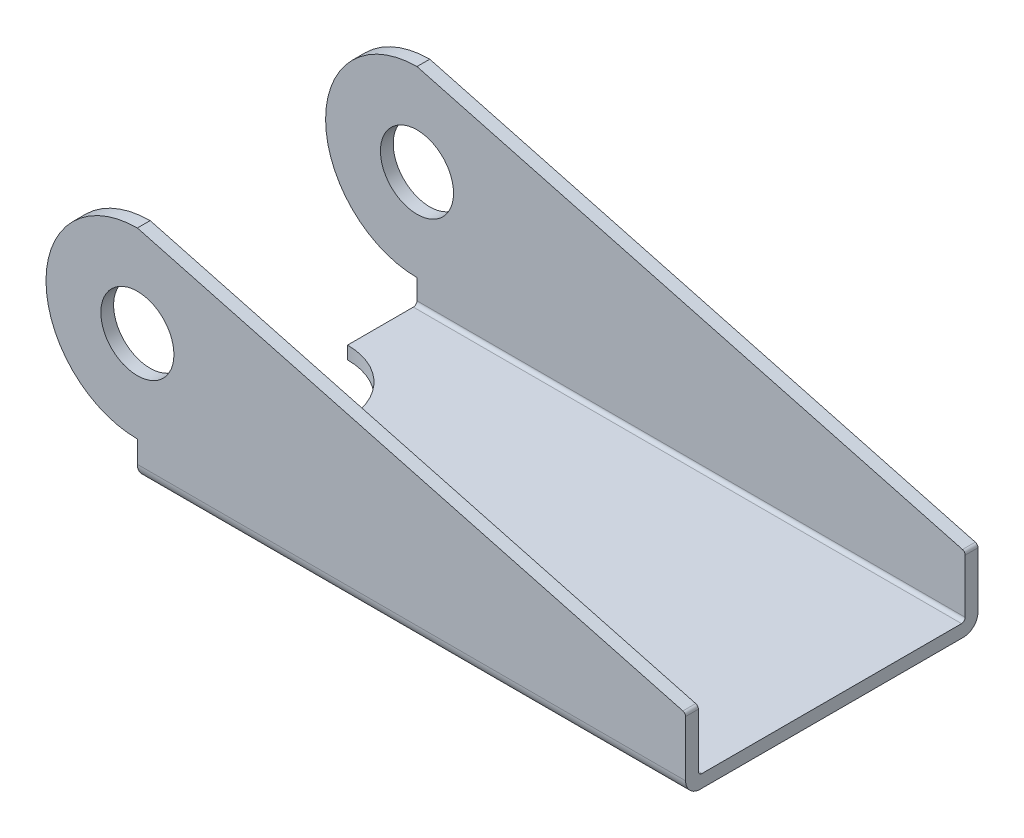
ISO-10303-21;
HEADER;
FILE_DESCRIPTION(('STEP AP214'),'2;1');
FILE_NAME('part.step','',(''),(''),'','','');
FILE_SCHEMA(('AUTOMOTIVE_DESIGN { 1 0 10303 214 1 1 1 1 }'));
ENDSEC;
DATA;
#1=APPLICATION_CONTEXT('core data for automotive mechanical design processes');
#2=APPLICATION_PROTOCOL_DEFINITION('international standard','automotive_design',2000,#1);
#3=PRODUCT_CONTEXT('',#1,'mechanical');
#4=PRODUCT('Part','Part','',(#3));
#5=PRODUCT_RELATED_PRODUCT_CATEGORY('part','',(#4));
#6=PRODUCT_DEFINITION_FORMATION('','',#4);
#7=PRODUCT_DEFINITION_CONTEXT('part definition',#1,'design');
#8=PRODUCT_DEFINITION('design','',#6,#7);
#9=PRODUCT_DEFINITION_SHAPE('','',#8);
#10=(LENGTH_UNIT() NAMED_UNIT(*) SI_UNIT(.MILLI.,.METRE.));
#11=(NAMED_UNIT(*) PLANE_ANGLE_UNIT() SI_UNIT($,.RADIAN.));
#12=(NAMED_UNIT(*) SI_UNIT($,.STERADIAN.) SOLID_ANGLE_UNIT());
#13=UNCERTAINTY_MEASURE_WITH_UNIT(LENGTH_MEASURE(1.E-05),#10,'distance_accuracy_value','');
#14=(GEOMETRIC_REPRESENTATION_CONTEXT(3) GLOBAL_UNCERTAINTY_ASSIGNED_CONTEXT((#13)) GLOBAL_UNIT_ASSIGNED_CONTEXT((#10,
#11,#12)) REPRESENTATION_CONTEXT('',''));
#15=CARTESIAN_POINT('',(0.,0.,0.));
#16=DIRECTION('',(0.,0.,1.));
#17=DIRECTION('',(1.,0.,0.));
#18=AXIS2_PLACEMENT_3D('',#15,#16,#17);
#19=CARTESIAN_POINT('',(-19.05,0.,-10.16));
#20=DIRECTION('',(-1.,0.,0.));
#21=DIRECTION('',(0.,-1.,0.));
#22=AXIS2_PLACEMENT_3D('',#19,#20,#21);
#23=PLANE('',#22);
#24=DIRECTION('',(0.,0.,1.));
#25=VECTOR('',#24,1.);
#26=CARTESIAN_POINT('',(-19.05,0.,-10.16));
#27=LINE('',#26,#25);
#28=CARTESIAN_POINT('',(-19.05,0.,4.445));
#29=VERTEX_POINT('',#28);
#30=CARTESIAN_POINT('',(-19.05,0.,9.144));
#31=VERTEX_POINT('',#30);
#32=EDGE_CURVE('E186',#29,#31,#27,.T.);
#33=ORIENTED_EDGE('',*,*,#32,.T.);
#34=CARTESIAN_POINT('',(-19.05,1.016,9.144));
#35=DIRECTION('',(-1.,0.,0.));
#36=DIRECTION('',(0.,-1.,0.));
#37=AXIS2_PLACEMENT_3D('',#34,#35,#36);
#38=CIRCLE('',#37,1.016);
#39=CARTESIAN_POINT('',(-19.05,1.016,10.16));
#40=VERTEX_POINT('',#39);
#41=EDGE_CURVE('E11',#31,#40,#38,.T.);
#42=ORIENTED_EDGE('',*,*,#41,.T.);
#43=DIRECTION('',(0.,-1.,0.));
#44=VECTOR('',#43,1.);
#45=CARTESIAN_POINT('',(-19.05,0.,10.16));
#46=LINE('',#45,#44);
#47=CARTESIAN_POINT('',(-19.05,2.54,10.16));
#48=VERTEX_POINT('',#47);
#49=EDGE_CURVE('E298',#48,#40,#46,.T.);
#50=ORIENTED_EDGE('',*,*,#49,.F.);
#51=DIRECTION('',(0.,0.,1.));
#52=VECTOR('',#51,1.);
#53=CARTESIAN_POINT('',(-19.05,2.54,-10.16));
#54=LINE('',#53,#52);
#55=CARTESIAN_POINT('',(-19.05,2.54,9.271));
#56=VERTEX_POINT('',#55);
#57=EDGE_CURVE('E328',#56,#48,#54,.T.);
#58=ORIENTED_EDGE('',*,*,#57,.F.);
#59=DIRECTION('',(0.,1.,0.));
#60=VECTOR('',#59,1.);
#61=CARTESIAN_POINT('',(-19.05,0.,9.271));
#62=LINE('',#61,#60);
#63=CARTESIAN_POINT('',(-19.05,1.143,9.271));
#64=VERTEX_POINT('',#63);
#65=EDGE_CURVE('E407',#64,#56,#62,.T.);
#66=ORIENTED_EDGE('',*,*,#65,.F.);
#67=CARTESIAN_POINT('',(-19.05,1.143,9.017));
#68=DIRECTION('',(-1.,0.,0.));
#69=DIRECTION('',(0.,-1.,0.));
#70=AXIS2_PLACEMENT_3D('',#67,#68,#69);
#71=CIRCLE('',#70,0.254);
#72=CARTESIAN_POINT('',(-19.05,0.889,9.017));
#73=VERTEX_POINT('',#72);
#74=EDGE_CURVE('E270',#64,#73,#71,.F.);
#75=ORIENTED_EDGE('',*,*,#74,.T.);
#76=DIRECTION('',(0.,0.,1.));
#77=VECTOR('',#76,1.);
#78=CARTESIAN_POINT('',(-19.05,0.889,-10.16));
#79=LINE('',#78,#77);
#80=CARTESIAN_POINT('',(-19.05,0.889,4.445));
#81=VERTEX_POINT('',#80);
#82=EDGE_CURVE('E188',#81,#73,#79,.T.);
#83=ORIENTED_EDGE('',*,*,#82,.F.);
#84=DIRECTION('',(0.,1.,0.));
#85=VECTOR('',#84,1.);
#86=CARTESIAN_POINT('',(-19.05,0.889,4.445));
#87=LINE('',#86,#85);
#88=EDGE_CURVE('E175',#29,#81,#87,.T.);
#89=ORIENTED_EDGE('',*,*,#88,.F.);
#90=EDGE_LOOP('',(#33,#42,#50,#58,#66,#75,#83,#89));
#91=FACE_BOUND('',#90,.T.);
#92=ADVANCED_FACE('F43',(#91),#23,.T.);
#93=CARTESIAN_POINT('',(-19.05,8.89,-10.16));
#94=DIRECTION('',(0.,0.,1.));
#95=DIRECTION('',(1.,0.,0.));
#96=AXIS2_PLACEMENT_3D('',#93,#94,#95);
#97=CYLINDRICAL_SURFACE('',#96,6.35);
#98=CARTESIAN_POINT('',(-19.05,8.89,-9.271));
#99=DIRECTION('',(0.,0.,-1.));
#100=DIRECTION('',(0.,1.,0.));
#101=AXIS2_PLACEMENT_3D('',#98,#99,#100);
#102=CIRCLE('',#101,6.35);
#103=CARTESIAN_POINT('',(-19.0500000000001,15.24,-9.271));
#104=VERTEX_POINT('',#103);
#105=CARTESIAN_POINT('',(-19.05,2.54,-9.271));
#106=VERTEX_POINT('',#105);
#107=EDGE_CURVE('E416',#104,#106,#102,.F.);
#108=ORIENTED_EDGE('',*,*,#107,.F.);
#109=DIRECTION('',(0.,0.,1.));
#110=VECTOR('',#109,1.);
#111=CARTESIAN_POINT('',(-19.05,15.24,-10.16));
#112=LINE('',#111,#110);
#113=CARTESIAN_POINT('',(-19.05,15.24,-10.16));
#114=VERTEX_POINT('',#113);
#115=EDGE_CURVE('E329',#114,#104,#112,.T.);
#116=ORIENTED_EDGE('',*,*,#115,.F.);
#117=CARTESIAN_POINT('',(-19.05,8.89,-10.16));
#118=DIRECTION('',(0.,0.,1.));
#119=DIRECTION('',(-1.,0.,0.));
#120=AXIS2_PLACEMENT_3D('',#117,#118,#119);
#121=CIRCLE('',#120,6.35);
#122=CARTESIAN_POINT('',(-19.05,2.54,-10.16));
#123=VERTEX_POINT('',#122);
#124=EDGE_CURVE('E198',#114,#123,#121,.T.);
#125=ORIENTED_EDGE('',*,*,#124,.T.);
#126=EDGE_CURVE('E214',#123,#106,#54,.T.);
#127=ORIENTED_EDGE('',*,*,#126,.T.);
#128=EDGE_LOOP('',(#108,#116,#125,#127));
#129=FACE_BOUND('',#128,.T.);
#130=ADVANCED_FACE('F354',(#129),#97,.T.);
#131=CARTESIAN_POINT('',(19.05,5.08,-10.16));
#132=DIRECTION('',(0.257662650560332,0.966234939601246,0.));
#133=DIRECTION('',(-0.966234939601246,0.257662650560332,0.));
#134=AXIS2_PLACEMENT_3D('',#131,#132,#133);
#135=PLANE('',#134);
#136=DIRECTION('',(-0.966234939601246,0.257662650560332,0.));
#137=VECTOR('',#136,1.);
#138=CARTESIAN_POINT('',(19.05,5.08,-9.271));
#139=LINE('',#138,#137);
#140=CARTESIAN_POINT('',(18.8614463132423,5.13028098313538,-9.271));
#141=VERTEX_POINT('',#140);
#142=EDGE_CURVE('E413',#141,#104,#139,.T.);
#143=ORIENTED_EDGE('',*,*,#142,.F.);
#144=DIRECTION('',(0.,0.,1.));
#145=VECTOR('',#144,1.);
#146=CARTESIAN_POINT('',(18.8614463132423,5.13028098313538,-10.16));
#147=LINE('',#146,#145);
#148=CARTESIAN_POINT('',(18.8614463132423,5.13028098313538,-10.16));
#149=VERTEX_POINT('',#148);
#150=EDGE_CURVE('E242',#141,#149,#147,.F.);
#151=ORIENTED_EDGE('',*,*,#150,.T.);
#152=DIRECTION('',(-0.966234939601246,0.257662650560332,0.));
#153=VECTOR('',#152,1.);
#154=CARTESIAN_POINT('',(19.05,5.08,-10.16));
#155=LINE('',#154,#153);
#156=EDGE_CURVE('E204',#149,#114,#155,.T.);
#157=ORIENTED_EDGE('',*,*,#156,.T.);
#158=ORIENTED_EDGE('',*,*,#115,.T.);
#159=EDGE_LOOP('',(#143,#151,#157,#158));
#160=FACE_BOUND('',#159,.T.);
#161=ADVANCED_FACE('F360',(#160),#135,.T.);
#162=DIRECTION('',(0.,-1.,0.));
#163=VECTOR('',#162,1.);
#164=CARTESIAN_POINT('',(-19.05,0.,-10.16));
#165=LINE('',#164,#163);
#166=CARTESIAN_POINT('',(-19.05,1.016,-10.16));
#167=VERTEX_POINT('',#166);
#168=EDGE_CURVE('E318',#123,#167,#165,.T.);
#169=ORIENTED_EDGE('',*,*,#168,.T.);
#170=CARTESIAN_POINT('',(-19.05,1.016,-9.144));
#171=DIRECTION('',(-1.,0.,0.));
#172=DIRECTION('',(0.,-1.,0.));
#173=AXIS2_PLACEMENT_3D('',#170,#171,#172);
#174=CIRCLE('',#173,1.016);
#175=CARTESIAN_POINT('',(-19.05,0.,-9.144));
#176=VERTEX_POINT('',#175);
#177=EDGE_CURVE('E287',#167,#176,#174,.T.);
#178=ORIENTED_EDGE('',*,*,#177,.T.);
#179=CARTESIAN_POINT('',(-19.05,0.,-4.445));
#180=VERTEX_POINT('',#179);
#181=EDGE_CURVE('E197',#176,#180,#27,.T.);
#182=ORIENTED_EDGE('',*,*,#181,.T.);
#183=DIRECTION('',(0.,1.,0.));
#184=VECTOR('',#183,1.);
#185=CARTESIAN_POINT('',(-19.05,0.889,-4.445));
#186=LINE('',#185,#184);
#187=CARTESIAN_POINT('',(-19.05,0.889,-4.445));
#188=VERTEX_POINT('',#187);
#189=EDGE_CURVE('E178',#188,#180,#186,.F.);
#190=ORIENTED_EDGE('',*,*,#189,.F.);
#191=CARTESIAN_POINT('',(-19.05,0.889,-9.017));
#192=VERTEX_POINT('',#191);
#193=EDGE_CURVE('E410',#192,#188,#79,.T.);
#194=ORIENTED_EDGE('',*,*,#193,.F.);
#195=CARTESIAN_POINT('',(-19.05,1.143,-9.017));
#196=DIRECTION('',(-1.,0.,0.));
#197=DIRECTION('',(0.,-1.,0.));
#198=AXIS2_PLACEMENT_3D('',#195,#196,#197);
#199=CIRCLE('',#198,0.254);
#200=CARTESIAN_POINT('',(-19.05,1.143,-9.271));
#201=VERTEX_POINT('',#200);
#202=EDGE_CURVE('E264',#192,#201,#199,.F.);
#203=ORIENTED_EDGE('',*,*,#202,.T.);
#204=DIRECTION('',(0.,-1.,0.));
#205=VECTOR('',#204,1.);
#206=CARTESIAN_POINT('',(-19.05,0.,-9.271));
#207=LINE('',#206,#205);
#208=EDGE_CURVE('E312',#106,#201,#207,.T.);
#209=ORIENTED_EDGE('',*,*,#208,.F.);
#210=ORIENTED_EDGE('',*,*,#126,.F.);
#211=EDGE_LOOP('',(#169,#178,#182,#190,#194,#203,#209,#210));
#212=FACE_BOUND('',#211,.T.);
#213=ADVANCED_FACE('F356',(#212),#23,.T.);
#214=CARTESIAN_POINT('',(-19.0500000000001,15.24,9.271));
#215=VERTEX_POINT('',#214);
#216=CARTESIAN_POINT('',(-19.05,15.24,10.16));
#217=VERTEX_POINT('',#216);
#218=EDGE_CURVE('E332',#215,#217,#112,.T.);
#219=ORIENTED_EDGE('',*,*,#218,.F.);
#220=CARTESIAN_POINT('',(-19.05,8.89,9.271));
#221=DIRECTION('',(0.,0.,1.));
#222=DIRECTION('',(0.,-1.,0.));
#223=AXIS2_PLACEMENT_3D('',#220,#221,#222);
#224=CIRCLE('',#223,6.35);
#225=EDGE_CURVE('E399',#56,#215,#224,.F.);
#226=ORIENTED_EDGE('',*,*,#225,.F.);
#227=ORIENTED_EDGE('',*,*,#57,.T.);
#228=CARTESIAN_POINT('',(-19.05,8.89,10.16));
#229=DIRECTION('',(0.,0.,1.));
#230=DIRECTION('',(-1.,0.,0.));
#231=AXIS2_PLACEMENT_3D('',#228,#229,#230);
#232=CIRCLE('',#231,6.35);
#233=EDGE_CURVE('E310',#217,#48,#232,.T.);
#234=ORIENTED_EDGE('',*,*,#233,.F.);
#235=EDGE_LOOP('',(#219,#226,#227,#234));
#236=FACE_BOUND('',#235,.T.);
#237=ADVANCED_FACE('F363',(#236),#97,.T.);
#238=DIRECTION('',(-0.966234939601246,0.257662650560332,0.));
#239=VECTOR('',#238,1.);
#240=CARTESIAN_POINT('',(19.05,5.08,10.16));
#241=LINE('',#240,#239);
#242=CARTESIAN_POINT('',(18.8614463132423,5.13028098313538,10.16));
#243=VERTEX_POINT('',#242);
#244=EDGE_CURVE('E306',#243,#217,#241,.T.);
#245=ORIENTED_EDGE('',*,*,#244,.F.);
#246=DIRECTION('',(0.,0.,1.));
#247=VECTOR('',#246,1.);
#248=CARTESIAN_POINT('',(18.8614463132423,5.13028098313538,-10.16));
#249=LINE('',#248,#247);
#250=CARTESIAN_POINT('',(18.8614463132423,5.13028098313538,9.271));
#251=VERTEX_POINT('',#250);
#252=EDGE_CURVE('E252',#243,#251,#249,.F.);
#253=ORIENTED_EDGE('',*,*,#252,.T.);
#254=DIRECTION('',(0.966234939601246,-0.257662650560332,0.));
#255=VECTOR('',#254,1.);
#256=CARTESIAN_POINT('',(19.05,5.08,9.271));
#257=LINE('',#256,#255);
#258=EDGE_CURVE('E393',#215,#251,#257,.T.);
#259=ORIENTED_EDGE('',*,*,#258,.F.);
#260=ORIENTED_EDGE('',*,*,#218,.T.);
#261=EDGE_LOOP('',(#245,#253,#259,#260));
#262=FACE_BOUND('',#261,.T.);
#263=ADVANCED_FACE('F372',(#262),#135,.T.);
#264=CARTESIAN_POINT('',(19.05,0.,-10.16));
#265=DIRECTION('',(1.,0.,0.));
#266=DIRECTION('',(0.,0.,-1.));
#267=AXIS2_PLACEMENT_3D('',#264,#265,#266);
#268=PLANE('',#267);
#269=DIRECTION('',(0.,0.,1.));
#270=VECTOR('',#269,1.);
#271=CARTESIAN_POINT('',(19.05,0.,-10.16));
#272=LINE('',#271,#270);
#273=CARTESIAN_POINT('',(19.05,0.,-9.144));
#274=VERTEX_POINT('',#273);
#275=CARTESIAN_POINT('',(19.05,0.,9.144));
#276=VERTEX_POINT('',#275);
#277=EDGE_CURVE('E202',#274,#276,#272,.T.);
#278=ORIENTED_EDGE('',*,*,#277,.F.);
#279=CARTESIAN_POINT('',(19.05,1.016,-9.144));
#280=DIRECTION('',(1.,0.,0.));
#281=DIRECTION('',(0.,0.,-1.));
#282=AXIS2_PLACEMENT_3D('',#279,#280,#281);
#283=CIRCLE('',#282,1.016);
#284=CARTESIAN_POINT('',(19.05,1.016,-10.16));
#285=VERTEX_POINT('',#284);
#286=EDGE_CURVE('E282',#274,#285,#283,.T.);
#287=ORIENTED_EDGE('',*,*,#286,.T.);
#288=DIRECTION('',(0.,1.,0.));
#289=VECTOR('',#288,1.);
#290=CARTESIAN_POINT('',(19.05,0.,-10.16));
#291=LINE('',#290,#289);
#292=CARTESIAN_POINT('',(19.05,4.88485730847666,-10.16));
#293=VERTEX_POINT('',#292);
#294=EDGE_CURVE('E321',#285,#293,#291,.T.);
#295=ORIENTED_EDGE('',*,*,#294,.T.);
#296=DIRECTION('',(0.,0.,1.));
#297=VECTOR('',#296,1.);
#298=CARTESIAN_POINT('',(19.05,4.88485730847666,-10.16));
#299=LINE('',#298,#297);
#300=CARTESIAN_POINT('',(19.05,4.88485730847666,-9.271));
#301=VERTEX_POINT('',#300);
#302=EDGE_CURVE('E238',#293,#301,#299,.T.);
#303=ORIENTED_EDGE('',*,*,#302,.T.);
#304=DIRECTION('',(0.,1.,0.));
#305=VECTOR('',#304,1.);
#306=CARTESIAN_POINT('',(19.05,0.889,-9.271));
#307=LINE('',#306,#305);
#308=CARTESIAN_POINT('',(19.05,1.143,-9.271));
#309=VERTEX_POINT('',#308);
#310=EDGE_CURVE('E387',#309,#301,#307,.T.);
#311=ORIENTED_EDGE('',*,*,#310,.F.);
#312=CARTESIAN_POINT('',(19.05,1.143,-9.017));
#313=DIRECTION('',(1.,0.,0.));
#314=DIRECTION('',(0.,0.,-1.));
#315=AXIS2_PLACEMENT_3D('',#312,#313,#314);
#316=CIRCLE('',#315,0.254);
#317=CARTESIAN_POINT('',(19.05,0.889,-9.017));
#318=VERTEX_POINT('',#317);
#319=EDGE_CURVE('E261',#309,#318,#316,.F.);
#320=ORIENTED_EDGE('',*,*,#319,.T.);
#321=DIRECTION('',(0.,0.,-1.));
#322=VECTOR('',#321,1.);
#323=CARTESIAN_POINT('',(19.05,0.889,9.271));
#324=LINE('',#323,#322);
#325=CARTESIAN_POINT('',(19.05,0.889,9.017));
#326=VERTEX_POINT('',#325);
#327=EDGE_CURVE('E394',#326,#318,#324,.T.);
#328=ORIENTED_EDGE('',*,*,#327,.F.);
#329=CARTESIAN_POINT('',(19.05,1.143,9.017));
#330=DIRECTION('',(1.,0.,0.));
#331=DIRECTION('',(0.,0.,-1.));
#332=AXIS2_PLACEMENT_3D('',#329,#330,#331);
#333=CIRCLE('',#332,0.254);
#334=CARTESIAN_POINT('',(19.05,1.143,9.271));
#335=VERTEX_POINT('',#334);
#336=EDGE_CURVE('E267',#326,#335,#333,.F.);
#337=ORIENTED_EDGE('',*,*,#336,.T.);
#338=DIRECTION('',(0.,-1.,0.));
#339=VECTOR('',#338,1.);
#340=CARTESIAN_POINT('',(19.05,0.,9.271));
#341=LINE('',#340,#339);
#342=CARTESIAN_POINT('',(19.05,4.88485730847666,9.271));
#343=VERTEX_POINT('',#342);
#344=EDGE_CURVE('E209',#343,#335,#341,.T.);
#345=ORIENTED_EDGE('',*,*,#344,.F.);
#346=DIRECTION('',(0.,0.,1.));
#347=VECTOR('',#346,1.);
#348=CARTESIAN_POINT('',(19.05,4.88485730847666,-10.16));
#349=LINE('',#348,#347);
#350=CARTESIAN_POINT('',(19.05,4.88485730847666,10.16));
#351=VERTEX_POINT('',#350);
#352=EDGE_CURVE('E234',#343,#351,#349,.T.);
#353=ORIENTED_EDGE('',*,*,#352,.T.);
#354=DIRECTION('',(0.,1.,0.));
#355=VECTOR('',#354,1.);
#356=CARTESIAN_POINT('',(19.05,0.,10.16));
#357=LINE('',#356,#355);
#358=CARTESIAN_POINT('',(19.05,1.016,10.16));
#359=VERTEX_POINT('',#358);
#360=EDGE_CURVE('E295',#359,#351,#357,.T.);
#361=ORIENTED_EDGE('',*,*,#360,.F.);
#362=CARTESIAN_POINT('',(19.05,1.016,9.144));
#363=DIRECTION('',(1.,0.,0.));
#364=DIRECTION('',(0.,0.,-1.));
#365=AXIS2_PLACEMENT_3D('',#362,#363,#364);
#366=CIRCLE('',#365,1.016);
#367=EDGE_CURVE('E279',#359,#276,#366,.T.);
#368=ORIENTED_EDGE('',*,*,#367,.T.);
#369=EDGE_LOOP('',(#278,#287,#295,#303,#311,#320,#328,#337,#345,#353,#361,#368));
#370=FACE_BOUND('',#369,.T.);
#371=ADVANCED_FACE('F302',(#370),#268,.T.);
#372=CARTESIAN_POINT('',(-19.05,0.,-10.16));
#373=DIRECTION('',(0.,-1.,0.));
#374=DIRECTION('',(1.,0.,0.));
#375=AXIS2_PLACEMENT_3D('',#372,#373,#374);
#376=PLANE('',#375);
#377=ORIENTED_EDGE('',*,*,#181,.F.);
#378=DIRECTION('',(1.,0.,0.));
#379=VECTOR('',#378,1.);
#380=CARTESIAN_POINT('',(-19.05,0.,-9.144));
#381=LINE('',#380,#379);
#382=EDGE_CURVE('E275',#176,#274,#381,.T.);
#383=ORIENTED_EDGE('',*,*,#382,.T.);
#384=ORIENTED_EDGE('',*,*,#277,.T.);
#385=DIRECTION('',(1.,0.,0.));
#386=VECTOR('',#385,1.);
#387=CARTESIAN_POINT('',(-19.05,0.,9.144));
#388=LINE('',#387,#386);
#389=EDGE_CURVE('E195',#276,#31,#388,.F.);
#390=ORIENTED_EDGE('',*,*,#389,.T.);
#391=ORIENTED_EDGE('',*,*,#32,.F.);
#392=CARTESIAN_POINT('',(-19.05,0.,0.));
#393=DIRECTION('',(0.,1.,0.));
#394=DIRECTION('',(0.,0.,1.));
#395=AXIS2_PLACEMENT_3D('',#392,#393,#394);
#396=CIRCLE('',#395,4.445);
#397=EDGE_CURVE('E171',#29,#180,#396,.T.);
#398=ORIENTED_EDGE('',*,*,#397,.T.);
#399=EDGE_LOOP('',(#377,#383,#384,#390,#391,#398));
#400=FACE_BOUND('',#399,.T.);
#401=ADVANCED_FACE('F192',(#400),#376,.T.);
#402=CARTESIAN_POINT('',(-19.05,8.89,-10.16));
#403=DIRECTION('',(0.,0.,-1.));
#404=DIRECTION('',(-1.,0.,0.));
#405=AXIS2_PLACEMENT_3D('',#402,#403,#404);
#406=PLANE('',#405);
#407=CARTESIAN_POINT('',(-19.05,8.89,-10.16));
#408=DIRECTION('',(0.,0.,1.));
#409=DIRECTION('',(1.,0.,0.));
#410=AXIS2_PLACEMENT_3D('',#407,#408,#409);
#411=CIRCLE('',#410,2.54);
#412=CARTESIAN_POINT('',(-16.51,8.89,-10.16));
#413=VERTEX_POINT('',#412);
#414=EDGE_CURVE('E220',#413,#413,#411,.T.);
#415=ORIENTED_EDGE('',*,*,#414,.T.);
#416=EDGE_LOOP('',(#415));
#417=FACE_BOUND('',#416,.T.);
#418=ORIENTED_EDGE('',*,*,#294,.F.);
#419=DIRECTION('',(1.,0.,0.));
#420=VECTOR('',#419,1.);
#421=CARTESIAN_POINT('',(-19.05,1.016,-10.16));
#422=LINE('',#421,#420);
#423=EDGE_CURVE('E65',#285,#167,#422,.F.);
#424=ORIENTED_EDGE('',*,*,#423,.T.);
#425=ORIENTED_EDGE('',*,*,#168,.F.);
#426=ORIENTED_EDGE('',*,*,#124,.F.);
#427=ORIENTED_EDGE('',*,*,#156,.F.);
#428=CARTESIAN_POINT('',(18.796,4.88485730847666,-10.16));
#429=DIRECTION('',(0.,0.,-1.));
#430=DIRECTION('',(-1.,0.,0.));
#431=AXIS2_PLACEMENT_3D('',#428,#429,#430);
#432=CIRCLE('',#431,0.254);
#433=EDGE_CURVE('E245',#149,#293,#432,.T.);
#434=ORIENTED_EDGE('',*,*,#433,.T.);
#435=EDGE_LOOP('',(#418,#424,#425,#426,#427,#434));
#436=FACE_BOUND('',#435,.T.);
#437=ADVANCED_FACE('F378',(#417,#436),#406,.T.);
#438=CARTESIAN_POINT('',(-19.05,8.89,10.16));
#439=DIRECTION('',(0.,0.,-1.));
#440=DIRECTION('',(-1.,0.,0.));
#441=AXIS2_PLACEMENT_3D('',#438,#439,#440);
#442=PLANE('',#441);
#443=CARTESIAN_POINT('',(-19.05,8.89,10.16));
#444=DIRECTION('',(0.,0.,1.));
#445=DIRECTION('',(1.,0.,0.));
#446=AXIS2_PLACEMENT_3D('',#443,#444,#445);
#447=CIRCLE('',#446,2.54);
#448=CARTESIAN_POINT('',(-16.51,8.89,10.16));
#449=VERTEX_POINT('',#448);
#450=EDGE_CURVE('E190',#449,#449,#447,.T.);
#451=ORIENTED_EDGE('',*,*,#450,.F.);
#452=EDGE_LOOP('',(#451));
#453=FACE_BOUND('',#452,.T.);
#454=ORIENTED_EDGE('',*,*,#49,.T.);
#455=DIRECTION('',(1.,0.,0.));
#456=VECTOR('',#455,1.);
#457=CARTESIAN_POINT('',(19.05,1.016,10.16));
#458=LINE('',#457,#456);
#459=EDGE_CURVE('E52',#40,#359,#458,.T.);
#460=ORIENTED_EDGE('',*,*,#459,.T.);
#461=ORIENTED_EDGE('',*,*,#360,.T.);
#462=CARTESIAN_POINT('',(18.796,4.88485730847666,10.16));
#463=DIRECTION('',(0.,0.,-1.));
#464=DIRECTION('',(-1.,0.,0.));
#465=AXIS2_PLACEMENT_3D('',#462,#463,#464);
#466=CIRCLE('',#465,0.254);
#467=EDGE_CURVE('E249',#351,#243,#466,.F.);
#468=ORIENTED_EDGE('',*,*,#467,.T.);
#469=ORIENTED_EDGE('',*,*,#244,.T.);
#470=ORIENTED_EDGE('',*,*,#233,.T.);
#471=EDGE_LOOP('',(#454,#460,#461,#468,#469,#470));
#472=FACE_BOUND('',#471,.T.);
#473=ADVANCED_FACE('F294',(#453,#472),#442,.F.);
#474=CARTESIAN_POINT('',(-25.4,0.889,-9.271));
#475=DIRECTION('',(0.,0.,-1.));
#476=DIRECTION('',(0.,1.,0.));
#477=AXIS2_PLACEMENT_3D('',#474,#475,#476);
#478=PLANE('',#477);
#479=CARTESIAN_POINT('',(-19.05,8.89,-9.271));
#480=DIRECTION('',(0.,0.,-1.));
#481=DIRECTION('',(0.,1.,0.));
#482=AXIS2_PLACEMENT_3D('',#479,#480,#481);
#483=CIRCLE('',#482,2.54);
#484=CARTESIAN_POINT('',(-19.05,11.43,-9.271));
#485=VERTEX_POINT('',#484);
#486=EDGE_CURVE('E219',#485,#485,#483,.T.);
#487=ORIENTED_EDGE('',*,*,#486,.T.);
#488=EDGE_LOOP('',(#487));
#489=FACE_BOUND('',#488,.T.);
#490=ORIENTED_EDGE('',*,*,#208,.T.);
#491=DIRECTION('',(1.,0.,0.));
#492=VECTOR('',#491,1.);
#493=CARTESIAN_POINT('',(19.05,1.143,-9.271));
#494=LINE('',#493,#492);
#495=EDGE_CURVE('E223',#201,#309,#494,.T.);
#496=ORIENTED_EDGE('',*,*,#495,.T.);
#497=ORIENTED_EDGE('',*,*,#310,.T.);
#498=CARTESIAN_POINT('',(18.796,4.88485730847666,-9.271));
#499=DIRECTION('',(0.,0.,-1.));
#500=DIRECTION('',(0.,1.,0.));
#501=AXIS2_PLACEMENT_3D('',#498,#499,#500);
#502=CIRCLE('',#501,0.254);
#503=EDGE_CURVE('E213',#301,#141,#502,.F.);
#504=ORIENTED_EDGE('',*,*,#503,.T.);
#505=ORIENTED_EDGE('',*,*,#142,.T.);
#506=ORIENTED_EDGE('',*,*,#107,.T.);
#507=EDGE_LOOP('',(#490,#496,#497,#504,#505,#506));
#508=FACE_BOUND('',#507,.T.);
#509=ADVANCED_FACE('F390',(#489,#508),#478,.F.);
#510=CARTESIAN_POINT('',(-25.4,0.889,9.271));
#511=DIRECTION('',(0.,-1.,0.));
#512=DIRECTION('',(0.,0.,-1.));
#513=AXIS2_PLACEMENT_3D('',#510,#511,#512);
#514=PLANE('',#513);
#515=ORIENTED_EDGE('',*,*,#327,.T.);
#516=DIRECTION('',(1.,0.,0.));
#517=VECTOR('',#516,1.);
#518=CARTESIAN_POINT('',(-19.05,0.889,-9.017));
#519=LINE('',#518,#517);
#520=EDGE_CURVE('E231',#318,#192,#519,.F.);
#521=ORIENTED_EDGE('',*,*,#520,.T.);
#522=ORIENTED_EDGE('',*,*,#193,.T.);
#523=CARTESIAN_POINT('',(-19.05,0.889,0.));
#524=DIRECTION('',(0.,1.,0.));
#525=DIRECTION('',(0.,0.,1.));
#526=AXIS2_PLACEMENT_3D('',#523,#524,#525);
#527=CIRCLE('',#526,4.445);
#528=EDGE_CURVE('E183',#81,#188,#527,.T.);
#529=ORIENTED_EDGE('',*,*,#528,.F.);
#530=ORIENTED_EDGE('',*,*,#82,.T.);
#531=DIRECTION('',(1.,0.,0.));
#532=VECTOR('',#531,1.);
#533=CARTESIAN_POINT('',(19.05,0.889,9.017));
#534=LINE('',#533,#532);
#535=EDGE_CURVE('E227',#73,#326,#534,.T.);
#536=ORIENTED_EDGE('',*,*,#535,.T.);
#537=EDGE_LOOP('',(#515,#521,#522,#529,#530,#536));
#538=FACE_BOUND('',#537,.T.);
#539=ADVANCED_FACE('F426',(#538),#514,.F.);
#540=CARTESIAN_POINT('',(-25.4,15.24,9.271));
#541=DIRECTION('',(0.,0.,1.));
#542=DIRECTION('',(0.,-1.,0.));
#543=AXIS2_PLACEMENT_3D('',#540,#541,#542);
#544=PLANE('',#543);
#545=CARTESIAN_POINT('',(-19.05,8.89,9.271));
#546=DIRECTION('',(0.,0.,1.));
#547=DIRECTION('',(0.,-1.,0.));
#548=AXIS2_PLACEMENT_3D('',#545,#546,#547);
#549=CIRCLE('',#548,2.54);
#550=CARTESIAN_POINT('',(-19.05,6.35,9.271));
#551=VERTEX_POINT('',#550);
#552=EDGE_CURVE('E215',#551,#551,#549,.T.);
#553=ORIENTED_EDGE('',*,*,#552,.T.);
#554=EDGE_LOOP('',(#553));
#555=FACE_BOUND('',#554,.T.);
#556=ORIENTED_EDGE('',*,*,#258,.T.);
#557=CARTESIAN_POINT('',(18.796,4.88485730847666,9.271));
#558=DIRECTION('',(0.,0.,1.));
#559=DIRECTION('',(0.,-1.,0.));
#560=AXIS2_PLACEMENT_3D('',#557,#558,#559);
#561=CIRCLE('',#560,0.254);
#562=EDGE_CURVE('E258',#251,#343,#561,.F.);
#563=ORIENTED_EDGE('',*,*,#562,.T.);
#564=ORIENTED_EDGE('',*,*,#344,.T.);
#565=DIRECTION('',(1.,0.,0.));
#566=VECTOR('',#565,1.);
#567=CARTESIAN_POINT('',(-19.05,1.143,9.271));
#568=LINE('',#567,#566);
#569=EDGE_CURVE('E255',#335,#64,#568,.F.);
#570=ORIENTED_EDGE('',*,*,#569,.T.);
#571=ORIENTED_EDGE('',*,*,#65,.T.);
#572=ORIENTED_EDGE('',*,*,#225,.T.);
#573=EDGE_LOOP('',(#556,#563,#564,#570,#571,#572));
#574=FACE_BOUND('',#573,.T.);
#575=ADVANCED_FACE('F433',(#555,#574),#544,.F.);
#576=CARTESIAN_POINT('',(-19.05,8.89,10.16));
#577=DIRECTION('',(0.,0.,1.));
#578=DIRECTION('',(1.,0.,0.));
#579=AXIS2_PLACEMENT_3D('',#576,#577,#578);
#580=CYLINDRICAL_SURFACE('',#579,2.54);
#581=ORIENTED_EDGE('',*,*,#450,.T.);
#582=EDGE_LOOP('',(#581));
#583=FACE_BOUND('',#582,.T.);
#584=ORIENTED_EDGE('',*,*,#552,.F.);
#585=EDGE_LOOP('',(#584));
#586=FACE_BOUND('',#585,.T.);
#587=ADVANCED_FACE('F461',(#583,#586),#580,.F.);
#588=ORIENTED_EDGE('',*,*,#414,.F.);
#589=EDGE_LOOP('',(#588));
#590=FACE_BOUND('',#589,.T.);
#591=ORIENTED_EDGE('',*,*,#486,.F.);
#592=EDGE_LOOP('',(#591));
#593=FACE_BOUND('',#592,.T.);
#594=ADVANCED_FACE('F468',(#590,#593),#580,.F.);
#595=CARTESIAN_POINT('',(-19.05,0.889,0.));
#596=DIRECTION('',(0.,1.,0.));
#597=DIRECTION('',(0.,0.,1.));
#598=AXIS2_PLACEMENT_3D('',#595,#596,#597);
#599=CYLINDRICAL_SURFACE('',#598,4.445);
#600=ORIENTED_EDGE('',*,*,#88,.T.);
#601=ORIENTED_EDGE('',*,*,#528,.T.);
#602=ORIENTED_EDGE('',*,*,#189,.T.);
#603=ORIENTED_EDGE('',*,*,#397,.F.);
#604=EDGE_LOOP('',(#600,#601,#602,#603));
#605=FACE_BOUND('',#604,.T.);
#606=ADVANCED_FACE('F173',(#605),#599,.F.);
#607=CARTESIAN_POINT('',(-25.4,1.143,-9.017));
#608=DIRECTION('',(-1.,0.,0.));
#609=DIRECTION('',(0.,0.,1.));
#610=AXIS2_PLACEMENT_3D('',#607,#608,#609);
#611=CYLINDRICAL_SURFACE('',#610,0.254);
#612=ORIENTED_EDGE('',*,*,#202,.F.);
#613=ORIENTED_EDGE('',*,*,#520,.F.);
#614=ORIENTED_EDGE('',*,*,#319,.F.);
#615=ORIENTED_EDGE('',*,*,#495,.F.);
#616=EDGE_LOOP('',(#612,#613,#614,#615));
#617=FACE_BOUND('',#616,.T.);
#618=ADVANCED_FACE('F422',(#617),#611,.F.);
#619=CARTESIAN_POINT('',(18.796,4.88485730847666,-10.16));
#620=DIRECTION('',(0.,0.,1.));
#621=DIRECTION('',(1.,0.,0.));
#622=AXIS2_PLACEMENT_3D('',#619,#620,#621);
#623=CYLINDRICAL_SURFACE('',#622,0.254);
#624=ORIENTED_EDGE('',*,*,#433,.F.);
#625=ORIENTED_EDGE('',*,*,#150,.F.);
#626=ORIENTED_EDGE('',*,*,#503,.F.);
#627=ORIENTED_EDGE('',*,*,#302,.F.);
#628=EDGE_LOOP('',(#624,#625,#626,#627));
#629=FACE_BOUND('',#628,.T.);
#630=ADVANCED_FACE('F384',(#629),#623,.T.);
#631=CARTESIAN_POINT('',(18.796,4.88485730847666,-10.16));
#632=DIRECTION('',(0.,0.,1.));
#633=DIRECTION('',(1.,0.,0.));
#634=AXIS2_PLACEMENT_3D('',#631,#632,#633);
#635=CYLINDRICAL_SURFACE('',#634,0.254);
#636=ORIENTED_EDGE('',*,*,#562,.F.);
#637=ORIENTED_EDGE('',*,*,#252,.F.);
#638=ORIENTED_EDGE('',*,*,#467,.F.);
#639=ORIENTED_EDGE('',*,*,#352,.F.);
#640=EDGE_LOOP('',(#636,#637,#638,#639));
#641=FACE_BOUND('',#640,.T.);
#642=ADVANCED_FACE('F438',(#641),#635,.T.);
#643=CARTESIAN_POINT('',(-25.4,1.143,9.017));
#644=DIRECTION('',(-1.,0.,0.));
#645=DIRECTION('',(0.,0.,1.));
#646=AXIS2_PLACEMENT_3D('',#643,#644,#645);
#647=CYLINDRICAL_SURFACE('',#646,0.254);
#648=ORIENTED_EDGE('',*,*,#74,.F.);
#649=ORIENTED_EDGE('',*,*,#569,.F.);
#650=ORIENTED_EDGE('',*,*,#336,.F.);
#651=ORIENTED_EDGE('',*,*,#535,.F.);
#652=EDGE_LOOP('',(#648,#649,#650,#651));
#653=FACE_BOUND('',#652,.T.);
#654=ADVANCED_FACE('F351',(#653),#647,.F.);
#655=CARTESIAN_POINT('',(-19.05,1.016,-9.144));
#656=DIRECTION('',(1.,0.,0.));
#657=DIRECTION('',(0.,1.,0.));
#658=AXIS2_PLACEMENT_3D('',#655,#656,#657);
#659=CYLINDRICAL_SURFACE('',#658,1.016);
#660=ORIENTED_EDGE('',*,*,#177,.F.);
#661=ORIENTED_EDGE('',*,*,#423,.F.);
#662=ORIENTED_EDGE('',*,*,#286,.F.);
#663=ORIENTED_EDGE('',*,*,#382,.F.);
#664=EDGE_LOOP('',(#660,#661,#662,#663));
#665=FACE_BOUND('',#664,.T.);
#666=ADVANCED_FACE('F347',(#665),#659,.T.);
#667=CARTESIAN_POINT('',(-19.05,1.016,9.144));
#668=DIRECTION('',(-1.,0.,0.));
#669=DIRECTION('',(0.,-1.,0.));
#670=AXIS2_PLACEMENT_3D('',#667,#668,#669);
#671=CYLINDRICAL_SURFACE('',#670,1.016);
#672=ORIENTED_EDGE('',*,*,#41,.F.);
#673=ORIENTED_EDGE('',*,*,#389,.F.);
#674=ORIENTED_EDGE('',*,*,#367,.F.);
#675=ORIENTED_EDGE('',*,*,#459,.F.);
#676=EDGE_LOOP('',(#672,#673,#674,#675));
#677=FACE_BOUND('',#676,.T.);
#678=ADVANCED_FACE('F45',(#677),#671,.T.);
#679=CLOSED_SHELL('',(#92,#130,#161,#213,#237,#263,#371,#401,#437,#473,#509,#539,#575,#587,#594,
#606,#618,#630,#642,#654,#666,#678));
#680=MANIFOLD_SOLID_BREP('B2',#679);
#681=ADVANCED_BREP_SHAPE_REPRESENTATION('',(#18,#680),#14);
#682=SHAPE_DEFINITION_REPRESENTATION(#9,#681);
ENDSEC;
END-ISO-10303-21;
